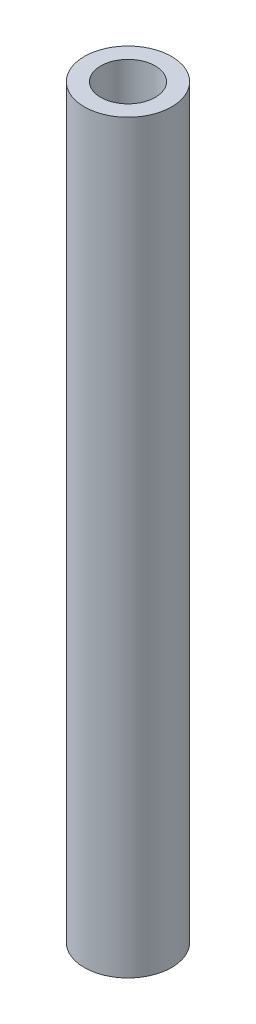
ISO-10303-21;
HEADER;
FILE_DESCRIPTION(('STEP AP214'),'2;1');
FILE_NAME('part.step','',(''),(''),'','','');
FILE_SCHEMA(('AUTOMOTIVE_DESIGN { 1 0 10303 214 1 1 1 1 }'));
ENDSEC;
DATA;
#1=APPLICATION_CONTEXT('core data for automotive mechanical design processes');
#2=APPLICATION_PROTOCOL_DEFINITION('international standard','automotive_design',2000,#1);
#3=PRODUCT_CONTEXT('',#1,'mechanical');
#4=PRODUCT('Part','Part','',(#3));
#5=PRODUCT_RELATED_PRODUCT_CATEGORY('part','',(#4));
#6=PRODUCT_DEFINITION_FORMATION('','',#4);
#7=PRODUCT_DEFINITION_CONTEXT('part definition',#1,'design');
#8=PRODUCT_DEFINITION('design','',#6,#7);
#9=PRODUCT_DEFINITION_SHAPE('','',#8);
#10=(LENGTH_UNIT() NAMED_UNIT(*) SI_UNIT(.MILLI.,.METRE.));
#11=(NAMED_UNIT(*) PLANE_ANGLE_UNIT() SI_UNIT($,.RADIAN.));
#12=(NAMED_UNIT(*) SI_UNIT($,.STERADIAN.) SOLID_ANGLE_UNIT());
#13=UNCERTAINTY_MEASURE_WITH_UNIT(LENGTH_MEASURE(1.E-05),#10,'distance_accuracy_value','');
#14=(GEOMETRIC_REPRESENTATION_CONTEXT(3) GLOBAL_UNCERTAINTY_ASSIGNED_CONTEXT((#13)) GLOBAL_UNIT_ASSIGNED_CONTEXT((#10,
#11,#12)) REPRESENTATION_CONTEXT('',''));
#15=CARTESIAN_POINT('',(0.,0.,0.));
#16=DIRECTION('',(0.,0.,1.));
#17=DIRECTION('',(1.,0.,0.));
#18=AXIS2_PLACEMENT_3D('',#15,#16,#17);
#19=CARTESIAN_POINT('',(-3.4437253432742,68.3,0.));
#20=DIRECTION('',(0.,1.,0.));
#21=DIRECTION('',(0.,0.,1.));
#22=AXIS2_PLACEMENT_3D('',#19,#20,#21);
#23=PLANE('',#22);
#24=CARTESIAN_POINT('',(-3.4437253432742,68.3,0.));
#25=DIRECTION('',(0.,1.,0.));
#26=DIRECTION('',(0.,0.,1.));
#27=AXIS2_PLACEMENT_3D('',#24,#25,#26);
#28=CIRCLE('',#27,4.);
#29=CARTESIAN_POINT('',(-3.4437253432742,68.3,4.));
#30=VERTEX_POINT('',#29);
#31=EDGE_CURVE('E10',#30,#30,#28,.T.);
#32=ORIENTED_EDGE('',*,*,#31,.T.);
#33=EDGE_LOOP('',(#32));
#34=FACE_BOUND('',#33,.T.);
#35=CARTESIAN_POINT('',(-3.4437253432742,68.3,0.));
#36=DIRECTION('',(0.,1.,0.));
#37=DIRECTION('',(0.,0.,1.));
#38=AXIS2_PLACEMENT_3D('',#35,#36,#37);
#39=CIRCLE('',#38,2.5);
#40=CARTESIAN_POINT('',(-3.4437253432742,68.3,2.5));
#41=VERTEX_POINT('',#40);
#42=EDGE_CURVE('E56',#41,#41,#39,.T.);
#43=ORIENTED_EDGE('',*,*,#42,.F.);
#44=EDGE_LOOP('',(#43));
#45=FACE_BOUND('',#44,.T.);
#46=ADVANCED_FACE('F43',(#34,#45),#23,.T.);
#47=CARTESIAN_POINT('',(-3.4437253432742,0.,0.));
#48=DIRECTION('',(0.,1.,0.));
#49=DIRECTION('',(0.,0.,1.));
#50=AXIS2_PLACEMENT_3D('',#47,#48,#49);
#51=PLANE('',#50);
#52=CARTESIAN_POINT('',(-3.4437253432742,0.,0.));
#53=DIRECTION('',(0.,1.,0.));
#54=DIRECTION('',(0.,0.,1.));
#55=AXIS2_PLACEMENT_3D('',#52,#53,#54);
#56=CIRCLE('',#55,4.);
#57=CARTESIAN_POINT('',(-3.4437253432742,0.,4.));
#58=VERTEX_POINT('',#57);
#59=EDGE_CURVE('E47',#58,#58,#56,.T.);
#60=ORIENTED_EDGE('',*,*,#59,.F.);
#61=EDGE_LOOP('',(#60));
#62=FACE_BOUND('',#61,.T.);
#63=CARTESIAN_POINT('',(-3.4437253432742,0.,0.));
#64=DIRECTION('',(0.,1.,0.));
#65=DIRECTION('',(0.,0.,1.));
#66=AXIS2_PLACEMENT_3D('',#63,#64,#65);
#67=CIRCLE('',#66,2.5);
#68=CARTESIAN_POINT('',(-3.4437253432742,0.,2.5));
#69=VERTEX_POINT('',#68);
#70=EDGE_CURVE('E58',#69,#69,#67,.T.);
#71=ORIENTED_EDGE('',*,*,#70,.T.);
#72=EDGE_LOOP('',(#71));
#73=FACE_BOUND('',#72,.T.);
#74=ADVANCED_FACE('F70',(#62,#73),#51,.F.);
#75=CARTESIAN_POINT('',(-3.4437253432742,68.3,0.));
#76=DIRECTION('',(0.,-1.,0.));
#77=DIRECTION('',(0.,0.,-1.));
#78=AXIS2_PLACEMENT_3D('',#75,#76,#77);
#79=CYLINDRICAL_SURFACE('',#78,4.);
#80=ORIENTED_EDGE('',*,*,#31,.F.);
#81=EDGE_LOOP('',(#80));
#82=FACE_BOUND('',#81,.T.);
#83=ORIENTED_EDGE('',*,*,#59,.T.);
#84=EDGE_LOOP('',(#83));
#85=FACE_BOUND('',#84,.T.);
#86=ADVANCED_FACE('F45',(#82,#85),#79,.T.);
#87=CARTESIAN_POINT('',(-3.4437253432742,68.3,0.));
#88=DIRECTION('',(0.,-1.,0.));
#89=DIRECTION('',(0.,0.,-1.));
#90=AXIS2_PLACEMENT_3D('',#87,#88,#89);
#91=CYLINDRICAL_SURFACE('',#90,2.5);
#92=ORIENTED_EDGE('',*,*,#42,.T.);
#93=EDGE_LOOP('',(#92));
#94=FACE_BOUND('',#93,.T.);
#95=ORIENTED_EDGE('',*,*,#70,.F.);
#96=EDGE_LOOP('',(#95));
#97=FACE_BOUND('',#96,.T.);
#98=ADVANCED_FACE('F66',(#94,#97),#91,.F.);
#99=CLOSED_SHELL('',(#46,#74,#86,#98));
#100=MANIFOLD_SOLID_BREP('B2',#99);
#101=ADVANCED_BREP_SHAPE_REPRESENTATION('',(#18,#100),#14);
#102=SHAPE_DEFINITION_REPRESENTATION(#9,#101);
ENDSEC;
END-ISO-10303-21;
